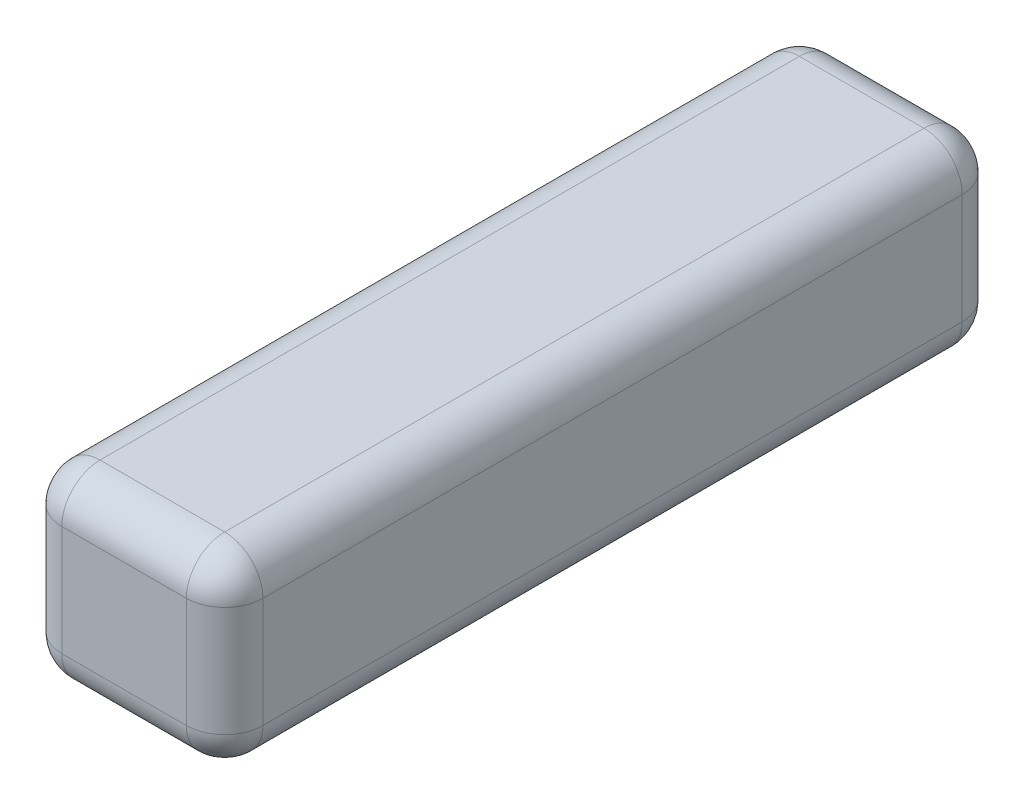
ISO-10303-21;
HEADER;
FILE_DESCRIPTION(('STEP AP214'),'2;1');
FILE_NAME('part.step','',(''),(''),'','','');
FILE_SCHEMA(('AUTOMOTIVE_DESIGN { 1 0 10303 214 1 1 1 1 }'));
ENDSEC;
DATA;
#1=APPLICATION_CONTEXT('core data for automotive mechanical design processes');
#2=APPLICATION_PROTOCOL_DEFINITION('international standard','automotive_design',2000,#1);
#3=PRODUCT_CONTEXT('',#1,'mechanical');
#4=PRODUCT('Part','Part','',(#3));
#5=PRODUCT_RELATED_PRODUCT_CATEGORY('part','',(#4));
#6=PRODUCT_DEFINITION_FORMATION('','',#4);
#7=PRODUCT_DEFINITION_CONTEXT('part definition',#1,'design');
#8=PRODUCT_DEFINITION('design','',#6,#7);
#9=PRODUCT_DEFINITION_SHAPE('','',#8);
#10=(LENGTH_UNIT() NAMED_UNIT(*) SI_UNIT(.MILLI.,.METRE.));
#11=(NAMED_UNIT(*) PLANE_ANGLE_UNIT() SI_UNIT($,.RADIAN.));
#12=(NAMED_UNIT(*) SI_UNIT($,.STERADIAN.) SOLID_ANGLE_UNIT());
#13=UNCERTAINTY_MEASURE_WITH_UNIT(LENGTH_MEASURE(1.E-05),#10,'distance_accuracy_value','');
#14=(GEOMETRIC_REPRESENTATION_CONTEXT(3) GLOBAL_UNCERTAINTY_ASSIGNED_CONTEXT((#13)) GLOBAL_UNIT_ASSIGNED_CONTEXT((#10,
#11,#12)) REPRESENTATION_CONTEXT('',''));
#15=CARTESIAN_POINT('',(0.,0.,0.));
#16=DIRECTION('',(0.,0.,1.));
#17=DIRECTION('',(1.,0.,0.));
#18=AXIS2_PLACEMENT_3D('',#15,#16,#17);
#19=CARTESIAN_POINT('',(-13.335,-12.3825,102.87));
#20=DIRECTION('',(1.,0.,0.));
#21=DIRECTION('',(0.,0.,-1.));
#22=AXIS2_PLACEMENT_3D('',#19,#20,#21);
#23=PLANE('',#22);
#24=DIRECTION('',(0.,0.,-1.));
#25=VECTOR('',#24,1.);
#26=CARTESIAN_POINT('',(-13.335,7.3025,102.87));
#27=LINE('',#26,#25);
#28=CARTESIAN_POINT('',(-13.335,7.3025,97.79));
#29=VERTEX_POINT('',#28);
#30=CARTESIAN_POINT('',(-13.335,7.3025,5.08));
#31=VERTEX_POINT('',#30);
#32=EDGE_CURVE('E313',#29,#31,#27,.T.);
#33=ORIENTED_EDGE('',*,*,#32,.T.);
#34=DIRECTION('',(0.,-1.,0.));
#35=VECTOR('',#34,1.);
#36=CARTESIAN_POINT('',(-13.335,-12.3825,5.08));
#37=LINE('',#36,#35);
#38=CARTESIAN_POINT('',(-13.335,-7.3025,5.08));
#39=VERTEX_POINT('',#38);
#40=EDGE_CURVE('E316',#31,#39,#37,.T.);
#41=ORIENTED_EDGE('',*,*,#40,.T.);
#42=DIRECTION('',(0.,0.,-1.));
#43=VECTOR('',#42,1.);
#44=CARTESIAN_POINT('',(-13.335,-7.3025,102.87));
#45=LINE('',#44,#43);
#46=CARTESIAN_POINT('',(-13.335,-7.3025,97.79));
#47=VERTEX_POINT('',#46);
#48=EDGE_CURVE('E311',#39,#47,#45,.F.);
#49=ORIENTED_EDGE('',*,*,#48,.T.);
#50=DIRECTION('',(0.,-1.,0.));
#51=VECTOR('',#50,1.);
#52=CARTESIAN_POINT('',(-13.335,-12.3825,97.79));
#53=LINE('',#52,#51);
#54=EDGE_CURVE('E309',#47,#29,#53,.F.);
#55=ORIENTED_EDGE('',*,*,#54,.T.);
#56=EDGE_LOOP('',(#33,#41,#49,#55));
#57=FACE_BOUND('',#56,.T.);
#58=ADVANCED_FACE('F37',(#57),#23,.F.);
#59=CARTESIAN_POINT('',(-13.335,-12.3825,102.87));
#60=DIRECTION('',(0.,1.,0.));
#61=DIRECTION('',(0.,0.,1.));
#62=AXIS2_PLACEMENT_3D('',#59,#60,#61);
#63=PLANE('',#62);
#64=DIRECTION('',(1.,0.,0.));
#65=VECTOR('',#64,1.);
#66=CARTESIAN_POINT('',(13.335,-12.3825,5.08));
#67=LINE('',#66,#65);
#68=CARTESIAN_POINT('',(-8.255,-12.3825,5.08));
#69=VERTEX_POINT('',#68);
#70=CARTESIAN_POINT('',(8.255,-12.3825,5.08));
#71=VERTEX_POINT('',#70);
#72=EDGE_CURVE('E304',#69,#71,#67,.T.);
#73=ORIENTED_EDGE('',*,*,#72,.T.);
#74=DIRECTION('',(0.,0.,-1.));
#75=VECTOR('',#74,1.);
#76=CARTESIAN_POINT('',(8.255,-12.3825,102.87));
#77=LINE('',#76,#75);
#78=CARTESIAN_POINT('',(8.255,-12.3825,97.79));
#79=VERTEX_POINT('',#78);
#80=EDGE_CURVE('E306',#71,#79,#77,.F.);
#81=ORIENTED_EDGE('',*,*,#80,.T.);
#82=DIRECTION('',(1.,0.,0.));
#83=VECTOR('',#82,1.);
#84=CARTESIAN_POINT('',(-13.335,-12.3825,97.79));
#85=LINE('',#84,#83);
#86=CARTESIAN_POINT('',(-8.255,-12.3825,97.79));
#87=VERTEX_POINT('',#86);
#88=EDGE_CURVE('E300',#79,#87,#85,.F.);
#89=ORIENTED_EDGE('',*,*,#88,.T.);
#90=DIRECTION('',(0.,0.,-1.));
#91=VECTOR('',#90,1.);
#92=CARTESIAN_POINT('',(-8.255,-12.3825,102.87));
#93=LINE('',#92,#91);
#94=EDGE_CURVE('E302',#87,#69,#93,.T.);
#95=ORIENTED_EDGE('',*,*,#94,.T.);
#96=EDGE_LOOP('',(#73,#81,#89,#95));
#97=FACE_BOUND('',#96,.T.);
#98=ADVANCED_FACE('F434',(#97),#63,.F.);
#99=CARTESIAN_POINT('',(13.335,-12.3825,102.87));
#100=DIRECTION('',(-1.,0.,0.));
#101=DIRECTION('',(0.,0.,1.));
#102=AXIS2_PLACEMENT_3D('',#99,#100,#101);
#103=PLANE('',#102);
#104=DIRECTION('',(0.,1.,0.));
#105=VECTOR('',#104,1.);
#106=CARTESIAN_POINT('',(13.335,12.3825,5.08));
#107=LINE('',#106,#105);
#108=CARTESIAN_POINT('',(13.335,-7.3025,5.08));
#109=VERTEX_POINT('',#108);
#110=CARTESIAN_POINT('',(13.335,7.3025,5.08));
#111=VERTEX_POINT('',#110);
#112=EDGE_CURVE('E286',#109,#111,#107,.T.);
#113=ORIENTED_EDGE('',*,*,#112,.T.);
#114=DIRECTION('',(0.,0.,-1.));
#115=VECTOR('',#114,1.);
#116=CARTESIAN_POINT('',(13.335,7.3025,102.87));
#117=LINE('',#116,#115);
#118=CARTESIAN_POINT('',(13.335,7.3025,97.79));
#119=VERTEX_POINT('',#118);
#120=EDGE_CURVE('E288',#111,#119,#117,.F.);
#121=ORIENTED_EDGE('',*,*,#120,.T.);
#122=DIRECTION('',(0.,1.,0.));
#123=VECTOR('',#122,1.);
#124=CARTESIAN_POINT('',(13.335,-12.3825,97.79));
#125=LINE('',#124,#123);
#126=CARTESIAN_POINT('',(13.335,-7.3025,97.79));
#127=VERTEX_POINT('',#126);
#128=EDGE_CURVE('E282',#119,#127,#125,.F.);
#129=ORIENTED_EDGE('',*,*,#128,.T.);
#130=DIRECTION('',(0.,0.,-1.));
#131=VECTOR('',#130,1.);
#132=CARTESIAN_POINT('',(13.335,-7.3025,102.87));
#133=LINE('',#132,#131);
#134=EDGE_CURVE('E284',#127,#109,#133,.T.);
#135=ORIENTED_EDGE('',*,*,#134,.T.);
#136=EDGE_LOOP('',(#113,#121,#129,#135));
#137=FACE_BOUND('',#136,.T.);
#138=ADVANCED_FACE('F472',(#137),#103,.F.);
#139=CARTESIAN_POINT('',(-13.335,12.3825,102.87));
#140=DIRECTION('',(0.,-1.,0.));
#141=DIRECTION('',(0.,0.,-1.));
#142=AXIS2_PLACEMENT_3D('',#139,#140,#141);
#143=PLANE('',#142);
#144=DIRECTION('',(-1.,0.,0.));
#145=VECTOR('',#144,1.);
#146=CARTESIAN_POINT('',(-13.335,12.3825,97.79));
#147=LINE('',#146,#145);
#148=CARTESIAN_POINT('',(-8.255,12.3825,97.79));
#149=VERTEX_POINT('',#148);
#150=CARTESIAN_POINT('',(8.255,12.3825,97.79));
#151=VERTEX_POINT('',#150);
#152=EDGE_CURVE('E273',#149,#151,#147,.F.);
#153=ORIENTED_EDGE('',*,*,#152,.T.);
#154=DIRECTION('',(0.,0.,-1.));
#155=VECTOR('',#154,1.);
#156=CARTESIAN_POINT('',(8.255,12.3825,102.87));
#157=LINE('',#156,#155);
#158=CARTESIAN_POINT('',(8.255,12.3825,5.08));
#159=VERTEX_POINT('',#158);
#160=EDGE_CURVE('E279',#151,#159,#157,.T.);
#161=ORIENTED_EDGE('',*,*,#160,.T.);
#162=DIRECTION('',(-1.,0.,0.));
#163=VECTOR('',#162,1.);
#164=CARTESIAN_POINT('',(-13.335,12.3825,5.08));
#165=LINE('',#164,#163);
#166=CARTESIAN_POINT('',(-8.255,12.3825,5.08));
#167=VERTEX_POINT('',#166);
#168=EDGE_CURVE('E277',#159,#167,#165,.T.);
#169=ORIENTED_EDGE('',*,*,#168,.T.);
#170=DIRECTION('',(0.,0.,-1.));
#171=VECTOR('',#170,1.);
#172=CARTESIAN_POINT('',(-8.255,12.3825,102.87));
#173=LINE('',#172,#171);
#174=EDGE_CURVE('E275',#167,#149,#173,.F.);
#175=ORIENTED_EDGE('',*,*,#174,.T.);
#176=EDGE_LOOP('',(#153,#161,#169,#175));
#177=FACE_BOUND('',#176,.T.);
#178=ADVANCED_FACE('F513',(#177),#143,.F.);
#179=CARTESIAN_POINT('',(0.,0.,102.87));
#180=DIRECTION('',(0.,0.,-1.));
#181=DIRECTION('',(-1.,0.,0.));
#182=AXIS2_PLACEMENT_3D('',#179,#180,#181);
#183=PLANE('',#182);
#184=DIRECTION('',(0.,1.,0.));
#185=VECTOR('',#184,1.);
#186=CARTESIAN_POINT('',(8.255,0.,102.87));
#187=LINE('',#186,#185);
#188=CARTESIAN_POINT('',(8.255,-7.3025,102.87));
#189=VERTEX_POINT('',#188);
#190=CARTESIAN_POINT('',(8.255,7.3025,102.87));
#191=VERTEX_POINT('',#190);
#192=EDGE_CURVE('E46',#189,#191,#187,.T.);
#193=ORIENTED_EDGE('',*,*,#192,.T.);
#194=DIRECTION('',(-1.,0.,0.));
#195=VECTOR('',#194,1.);
#196=CARTESIAN_POINT('',(0.,7.3025,102.87));
#197=LINE('',#196,#195);
#198=CARTESIAN_POINT('',(-8.255,7.3025,102.87));
#199=VERTEX_POINT('',#198);
#200=EDGE_CURVE('E11',#191,#199,#197,.T.);
#201=ORIENTED_EDGE('',*,*,#200,.T.);
#202=DIRECTION('',(0.,-1.,0.));
#203=VECTOR('',#202,1.);
#204=CARTESIAN_POINT('',(-8.255,0.,102.87));
#205=LINE('',#204,#203);
#206=CARTESIAN_POINT('',(-8.255,-7.3025,102.87));
#207=VERTEX_POINT('',#206);
#208=EDGE_CURVE('E318',#199,#207,#205,.T.);
#209=ORIENTED_EDGE('',*,*,#208,.T.);
#210=DIRECTION('',(1.,0.,0.));
#211=VECTOR('',#210,1.);
#212=CARTESIAN_POINT('',(0.,-7.3025,102.87));
#213=LINE('',#212,#211);
#214=EDGE_CURVE('E320',#207,#189,#213,.T.);
#215=ORIENTED_EDGE('',*,*,#214,.T.);
#216=EDGE_LOOP('',(#193,#201,#209,#215));
#217=FACE_BOUND('',#216,.T.);
#218=ADVANCED_FACE('F404',(#217),#183,.F.);
#219=CARTESIAN_POINT('',(0.,0.,0.));
#220=DIRECTION('',(0.,0.,-1.));
#221=DIRECTION('',(-1.,0.,0.));
#222=AXIS2_PLACEMENT_3D('',#219,#220,#221);
#223=PLANE('',#222);
#224=DIRECTION('',(0.,-1.,0.));
#225=VECTOR('',#224,1.);
#226=CARTESIAN_POINT('',(5.715,-0.317500000000001,0.));
#227=LINE('',#226,#225);
#228=CARTESIAN_POINT('',(5.715,-0.317500000000001,0.));
#229=VERTEX_POINT('',#228);
#230=CARTESIAN_POINT('',(5.715,-4.7625,0.));
#231=VERTEX_POINT('',#230);
#232=EDGE_CURVE('E54',#229,#231,#227,.T.);
#233=ORIENTED_EDGE('',*,*,#232,.F.);
#234=DIRECTION('',(1.,0.,0.));
#235=VECTOR('',#234,1.);
#236=CARTESIAN_POINT('',(5.715,-0.317500000000001,0.));
#237=LINE('',#236,#235);
#238=CARTESIAN_POINT('',(-5.715,-0.3175,0.));
#239=VERTEX_POINT('',#238);
#240=EDGE_CURVE('E208',#239,#229,#237,.T.);
#241=ORIENTED_EDGE('',*,*,#240,.F.);
#242=DIRECTION('',(0.,1.,0.));
#243=VECTOR('',#242,1.);
#244=CARTESIAN_POINT('',(-5.715,-0.3175,0.));
#245=LINE('',#244,#243);
#246=CARTESIAN_POINT('',(-5.715,-4.7625,0.));
#247=VERTEX_POINT('',#246);
#248=EDGE_CURVE('E211',#247,#239,#245,.T.);
#249=ORIENTED_EDGE('',*,*,#248,.F.);
#250=DIRECTION('',(-1.,0.,0.));
#251=VECTOR('',#250,1.);
#252=CARTESIAN_POINT('',(5.715,-4.7625,0.));
#253=LINE('',#252,#251);
#254=EDGE_CURVE('E217',#231,#247,#253,.T.);
#255=ORIENTED_EDGE('',*,*,#254,.F.);
#256=EDGE_LOOP('',(#233,#241,#249,#255));
#257=FACE_BOUND('',#256,.T.);
#258=DIRECTION('',(-0.6,-0.8,0.));
#259=VECTOR('',#258,1.);
#260=CARTESIAN_POINT('',(3.4925,3.4925,0.));
#261=LINE('',#260,#259);
#262=CARTESIAN_POINT('',(3.4925,3.4925,0.));
#263=VERTEX_POINT('',#262);
#264=CARTESIAN_POINT('',(2.54,2.2225,0.));
#265=VERTEX_POINT('',#264);
#266=EDGE_CURVE('E62',#263,#265,#261,.T.);
#267=ORIENTED_EDGE('',*,*,#266,.F.);
#268=DIRECTION('',(0.,-1.,0.));
#269=VECTOR('',#268,1.);
#270=CARTESIAN_POINT('',(3.4925,4.7625,0.));
#271=LINE('',#270,#269);
#272=CARTESIAN_POINT('',(3.4925,4.7625,0.));
#273=VERTEX_POINT('',#272);
#274=EDGE_CURVE('E240',#273,#263,#271,.T.);
#275=ORIENTED_EDGE('',*,*,#274,.F.);
#276=DIRECTION('',(1.,0.,0.));
#277=VECTOR('',#276,1.);
#278=CARTESIAN_POINT('',(3.4925,4.7625,0.));
#279=LINE('',#278,#277);
#280=CARTESIAN_POINT('',(-3.4925,4.7625,0.));
#281=VERTEX_POINT('',#280);
#282=EDGE_CURVE('E243',#281,#273,#279,.T.);
#283=ORIENTED_EDGE('',*,*,#282,.F.);
#284=DIRECTION('',(0.,1.,0.));
#285=VECTOR('',#284,1.);
#286=CARTESIAN_POINT('',(-3.4925,4.7625,0.));
#287=LINE('',#286,#285);
#288=CARTESIAN_POINT('',(-3.4925,3.4925,0.));
#289=VERTEX_POINT('',#288);
#290=EDGE_CURVE('E247',#289,#281,#287,.T.);
#291=ORIENTED_EDGE('',*,*,#290,.F.);
#292=DIRECTION('',(-0.6,0.8,0.));
#293=VECTOR('',#292,1.);
#294=CARTESIAN_POINT('',(-2.54,2.2225,0.));
#295=LINE('',#294,#293);
#296=CARTESIAN_POINT('',(-2.54,2.2225,0.));
#297=VERTEX_POINT('',#296);
#298=EDGE_CURVE('E250',#297,#289,#295,.T.);
#299=ORIENTED_EDGE('',*,*,#298,.F.);
#300=DIRECTION('',(-1.,0.,0.));
#301=VECTOR('',#300,1.);
#302=CARTESIAN_POINT('',(2.54,2.2225,0.));
#303=LINE('',#302,#301);
#304=EDGE_CURVE('E253',#265,#297,#303,.T.);
#305=ORIENTED_EDGE('',*,*,#304,.F.);
#306=EDGE_LOOP('',(#267,#275,#283,#291,#299,#305));
#307=FACE_BOUND('',#306,.T.);
#308=DIRECTION('',(-1.,0.,0.));
#309=VECTOR('',#308,1.);
#310=CARTESIAN_POINT('',(13.335,7.3025,0.));
#311=LINE('',#310,#309);
#312=CARTESIAN_POINT('',(-8.255,7.3025,0.));
#313=VERTEX_POINT('',#312);
#314=CARTESIAN_POINT('',(8.255,7.3025,0.));
#315=VERTEX_POINT('',#314);
#316=EDGE_CURVE('E295',#313,#315,#311,.F.);
#317=ORIENTED_EDGE('',*,*,#316,.T.);
#318=DIRECTION('',(0.,1.,0.));
#319=VECTOR('',#318,1.);
#320=CARTESIAN_POINT('',(8.255,-12.3825,0.));
#321=LINE('',#320,#319);
#322=CARTESIAN_POINT('',(8.255,-7.3025,0.));
#323=VERTEX_POINT('',#322);
#324=EDGE_CURVE('E297',#315,#323,#321,.F.);
#325=ORIENTED_EDGE('',*,*,#324,.T.);
#326=DIRECTION('',(1.,0.,0.));
#327=VECTOR('',#326,1.);
#328=CARTESIAN_POINT('',(-13.335,-7.3025,0.));
#329=LINE('',#328,#327);
#330=CARTESIAN_POINT('',(-8.255,-7.3025,0.));
#331=VERTEX_POINT('',#330);
#332=EDGE_CURVE('E293',#323,#331,#329,.F.);
#333=ORIENTED_EDGE('',*,*,#332,.T.);
#334=DIRECTION('',(0.,-1.,0.));
#335=VECTOR('',#334,1.);
#336=CARTESIAN_POINT('',(-8.255,12.3825,0.));
#337=LINE('',#336,#335);
#338=EDGE_CURVE('E291',#331,#313,#337,.F.);
#339=ORIENTED_EDGE('',*,*,#338,.T.);
#340=EDGE_LOOP('',(#317,#325,#333,#339));
#341=FACE_BOUND('',#340,.T.);
#342=ADVANCED_FACE('F520',(#257,#307,#341),#223,.T.);
#343=CARTESIAN_POINT('',(-8.255,-7.3025,102.87));
#344=DIRECTION('',(0.,0.,-1.));
#345=DIRECTION('',(-1.,0.,0.));
#346=AXIS2_PLACEMENT_3D('',#343,#344,#345);
#347=CYLINDRICAL_SURFACE('',#346,5.08);
#348=CARTESIAN_POINT('',(-8.255,-7.3025,97.79));
#349=DIRECTION('',(0.,0.,1.));
#350=DIRECTION('',(1.,0.,0.));
#351=AXIS2_PLACEMENT_3D('',#348,#349,#350);
#352=CIRCLE('',#351,5.08);
#353=EDGE_CURVE('E41',#47,#87,#352,.T.);
#354=ORIENTED_EDGE('',*,*,#353,.F.);
#355=ORIENTED_EDGE('',*,*,#48,.F.);
#356=CARTESIAN_POINT('',(-8.255,-7.3025,5.08));
#357=DIRECTION('',(0.,0.,-1.));
#358=DIRECTION('',(-1.,0.,0.));
#359=AXIS2_PLACEMENT_3D('',#356,#357,#358);
#360=CIRCLE('',#359,5.08);
#361=EDGE_CURVE('E381',#69,#39,#360,.T.);
#362=ORIENTED_EDGE('',*,*,#361,.F.);
#363=ORIENTED_EDGE('',*,*,#94,.F.);
#364=EDGE_LOOP('',(#354,#355,#362,#363));
#365=FACE_BOUND('',#364,.T.);
#366=ADVANCED_FACE('F39',(#365),#347,.T.);
#367=CARTESIAN_POINT('',(-8.255,-7.3025,97.79));
#368=DIRECTION('',(0.,-1.,0.));
#369=DIRECTION('',(0.,0.,-1.));
#370=AXIS2_PLACEMENT_3D('',#367,#368,#369);
#371=SPHERICAL_SURFACE('',#370,5.08);
#372=CARTESIAN_POINT('',(-8.255,-7.3025,97.79));
#373=DIRECTION('',(0.,-1.,0.));
#374=DIRECTION('',(0.,0.,-1.));
#375=AXIS2_PLACEMENT_3D('',#372,#373,#374);
#376=CIRCLE('',#375,5.08);
#377=EDGE_CURVE('E376',#47,#207,#376,.F.);
#378=ORIENTED_EDGE('',*,*,#377,.F.);
#379=ORIENTED_EDGE('',*,*,#353,.T.);
#380=CARTESIAN_POINT('',(-8.255,-7.3025,97.79));
#381=DIRECTION('',(-1.,0.,0.));
#382=DIRECTION('',(0.,0.,1.));
#383=AXIS2_PLACEMENT_3D('',#380,#381,#382);
#384=CIRCLE('',#383,5.08);
#385=EDGE_CURVE('E379',#207,#87,#384,.F.);
#386=ORIENTED_EDGE('',*,*,#385,.F.);
#387=EDGE_LOOP('',(#378,#379,#386));
#388=FACE_BOUND('',#387,.T.);
#389=ADVANCED_FACE('F392',(#388),#371,.T.);
#390=CARTESIAN_POINT('',(-8.255,-7.3025,5.08));
#391=DIRECTION('',(-1.,0.,0.));
#392=DIRECTION('',(0.,0.,1.));
#393=AXIS2_PLACEMENT_3D('',#390,#391,#392);
#394=SPHERICAL_SURFACE('',#393,5.08);
#395=CARTESIAN_POINT('',(-8.255,-7.3025,5.08));
#396=DIRECTION('',(-1.,0.,0.));
#397=DIRECTION('',(0.,0.,1.));
#398=AXIS2_PLACEMENT_3D('',#395,#396,#397);
#399=CIRCLE('',#398,5.08);
#400=EDGE_CURVE('E370',#69,#331,#399,.F.);
#401=ORIENTED_EDGE('',*,*,#400,.F.);
#402=ORIENTED_EDGE('',*,*,#361,.T.);
#403=CARTESIAN_POINT('',(-8.255,-7.3025,5.08));
#404=DIRECTION('',(0.,-1.,0.));
#405=DIRECTION('',(0.,0.,-1.));
#406=AXIS2_PLACEMENT_3D('',#403,#404,#405);
#407=CIRCLE('',#406,5.08);
#408=EDGE_CURVE('E373',#331,#39,#407,.F.);
#409=ORIENTED_EDGE('',*,*,#408,.F.);
#410=EDGE_LOOP('',(#401,#402,#409));
#411=FACE_BOUND('',#410,.T.);
#412=ADVANCED_FACE('F427',(#411),#394,.T.);
#413=CARTESIAN_POINT('',(0.,-7.3025,97.79));
#414=DIRECTION('',(1.,0.,0.));
#415=DIRECTION('',(0.,0.,-1.));
#416=AXIS2_PLACEMENT_3D('',#413,#414,#415);
#417=CYLINDRICAL_SURFACE('',#416,5.08);
#418=ORIENTED_EDGE('',*,*,#385,.T.);
#419=ORIENTED_EDGE('',*,*,#88,.F.);
#420=CARTESIAN_POINT('',(8.255,-7.3025,97.79));
#421=DIRECTION('',(1.,0.,0.));
#422=DIRECTION('',(0.,0.,-1.));
#423=AXIS2_PLACEMENT_3D('',#420,#421,#422);
#424=CIRCLE('',#423,5.08);
#425=EDGE_CURVE('E365',#189,#79,#424,.T.);
#426=ORIENTED_EDGE('',*,*,#425,.F.);
#427=ORIENTED_EDGE('',*,*,#214,.F.);
#428=EDGE_LOOP('',(#418,#419,#426,#427));
#429=FACE_BOUND('',#428,.T.);
#430=ADVANCED_FACE('F400',(#429),#417,.T.);
#431=CARTESIAN_POINT('',(-8.255,0.,97.79));
#432=DIRECTION('',(0.,-1.,0.));
#433=DIRECTION('',(0.,0.,-1.));
#434=AXIS2_PLACEMENT_3D('',#431,#432,#433);
#435=CYLINDRICAL_SURFACE('',#434,5.08);
#436=ORIENTED_EDGE('',*,*,#377,.T.);
#437=ORIENTED_EDGE('',*,*,#208,.F.);
#438=CARTESIAN_POINT('',(-8.255,7.3025,97.79));
#439=DIRECTION('',(0.,1.,0.));
#440=DIRECTION('',(0.,0.,1.));
#441=AXIS2_PLACEMENT_3D('',#438,#439,#440);
#442=CIRCLE('',#441,5.08);
#443=EDGE_CURVE('E362',#29,#199,#442,.T.);
#444=ORIENTED_EDGE('',*,*,#443,.F.);
#445=ORIENTED_EDGE('',*,*,#54,.F.);
#446=EDGE_LOOP('',(#436,#437,#444,#445));
#447=FACE_BOUND('',#446,.T.);
#448=ADVANCED_FACE('F410',(#447),#435,.T.);
#449=CARTESIAN_POINT('',(-8.255,7.3025,102.87));
#450=DIRECTION('',(0.,0.,-1.));
#451=DIRECTION('',(-1.,0.,0.));
#452=AXIS2_PLACEMENT_3D('',#449,#450,#451);
#453=CYLINDRICAL_SURFACE('',#452,5.08);
#454=CARTESIAN_POINT('',(-8.255,7.3025,5.08));
#455=DIRECTION('',(0.,0.,-1.));
#456=DIRECTION('',(-1.,0.,0.));
#457=AXIS2_PLACEMENT_3D('',#454,#455,#456);
#458=CIRCLE('',#457,5.08);
#459=EDGE_CURVE('E356',#31,#167,#458,.T.);
#460=ORIENTED_EDGE('',*,*,#459,.F.);
#461=ORIENTED_EDGE('',*,*,#32,.F.);
#462=CARTESIAN_POINT('',(-8.255,7.3025,97.79));
#463=DIRECTION('',(0.,0.,1.));
#464=DIRECTION('',(1.,0.,0.));
#465=AXIS2_PLACEMENT_3D('',#462,#463,#464);
#466=CIRCLE('',#465,5.08);
#467=EDGE_CURVE('E359',#149,#29,#466,.T.);
#468=ORIENTED_EDGE('',*,*,#467,.F.);
#469=ORIENTED_EDGE('',*,*,#174,.F.);
#470=EDGE_LOOP('',(#460,#461,#468,#469));
#471=FACE_BOUND('',#470,.T.);
#472=ADVANCED_FACE('F416',(#471),#453,.T.);
#473=CARTESIAN_POINT('',(-8.255,-12.3825,5.08));
#474=DIRECTION('',(0.,1.,0.));
#475=DIRECTION('',(0.,0.,1.));
#476=AXIS2_PLACEMENT_3D('',#473,#474,#475);
#477=CYLINDRICAL_SURFACE('',#476,5.08);
#478=ORIENTED_EDGE('',*,*,#408,.T.);
#479=ORIENTED_EDGE('',*,*,#40,.F.);
#480=CARTESIAN_POINT('',(-8.255,7.3025,5.08));
#481=DIRECTION('',(0.,1.,0.));
#482=DIRECTION('',(-1.,0.,0.));
#483=AXIS2_PLACEMENT_3D('',#480,#481,#482);
#484=CIRCLE('',#483,5.08);
#485=EDGE_CURVE('E354',#313,#31,#484,.T.);
#486=ORIENTED_EDGE('',*,*,#485,.F.);
#487=ORIENTED_EDGE('',*,*,#338,.F.);
#488=EDGE_LOOP('',(#478,#479,#486,#487));
#489=FACE_BOUND('',#488,.T.);
#490=ADVANCED_FACE('F424',(#489),#477,.T.);
#491=CARTESIAN_POINT('',(-13.335,-7.3025,5.08));
#492=DIRECTION('',(-1.,0.,0.));
#493=DIRECTION('',(0.,0.,1.));
#494=AXIS2_PLACEMENT_3D('',#491,#492,#493);
#495=CYLINDRICAL_SURFACE('',#494,5.08);
#496=ORIENTED_EDGE('',*,*,#400,.T.);
#497=ORIENTED_EDGE('',*,*,#332,.F.);
#498=CARTESIAN_POINT('',(8.255,-7.3025,5.08));
#499=DIRECTION('',(1.,0.,0.));
#500=DIRECTION('',(0.,0.,-1.));
#501=AXIS2_PLACEMENT_3D('',#498,#499,#500);
#502=CIRCLE('',#501,5.08);
#503=EDGE_CURVE('E351',#71,#323,#502,.T.);
#504=ORIENTED_EDGE('',*,*,#503,.F.);
#505=ORIENTED_EDGE('',*,*,#72,.F.);
#506=EDGE_LOOP('',(#496,#497,#504,#505));
#507=FACE_BOUND('',#506,.T.);
#508=ADVANCED_FACE('F431',(#507),#495,.T.);
#509=CARTESIAN_POINT('',(8.255,-7.3025,102.87));
#510=DIRECTION('',(0.,0.,-1.));
#511=DIRECTION('',(-1.,0.,0.));
#512=AXIS2_PLACEMENT_3D('',#509,#510,#511);
#513=CYLINDRICAL_SURFACE('',#512,5.08);
#514=CARTESIAN_POINT('',(8.255,-7.3025,97.79));
#515=DIRECTION('',(0.,0.,1.));
#516=DIRECTION('',(1.,0.,0.));
#517=AXIS2_PLACEMENT_3D('',#514,#515,#516);
#518=CIRCLE('',#517,5.08);
#519=EDGE_CURVE('E367',#79,#127,#518,.T.);
#520=ORIENTED_EDGE('',*,*,#519,.F.);
#521=ORIENTED_EDGE('',*,*,#80,.F.);
#522=CARTESIAN_POINT('',(8.255,-7.3025,5.08));
#523=DIRECTION('',(0.,0.,-1.));
#524=DIRECTION('',(-1.,0.,0.));
#525=AXIS2_PLACEMENT_3D('',#522,#523,#524);
#526=CIRCLE('',#525,5.08);
#527=EDGE_CURVE('E348',#109,#71,#526,.T.);
#528=ORIENTED_EDGE('',*,*,#527,.F.);
#529=ORIENTED_EDGE('',*,*,#134,.F.);
#530=EDGE_LOOP('',(#520,#521,#528,#529));
#531=FACE_BOUND('',#530,.T.);
#532=ADVANCED_FACE('F438',(#531),#513,.T.);
#533=CARTESIAN_POINT('',(8.255,-7.3025,97.79));
#534=DIRECTION('',(0.,-1.,0.));
#535=DIRECTION('',(0.,0.,-1.));
#536=AXIS2_PLACEMENT_3D('',#533,#534,#535);
#537=SPHERICAL_SURFACE('',#536,5.08);
#538=ORIENTED_EDGE('',*,*,#425,.T.);
#539=ORIENTED_EDGE('',*,*,#519,.T.);
#540=CARTESIAN_POINT('',(8.255,-7.3025,97.79));
#541=DIRECTION('',(0.,-1.,0.));
#542=DIRECTION('',(0.,0.,-1.));
#543=AXIS2_PLACEMENT_3D('',#540,#541,#542);
#544=CIRCLE('',#543,5.08);
#545=EDGE_CURVE('E345',#189,#127,#544,.F.);
#546=ORIENTED_EDGE('',*,*,#545,.F.);
#547=EDGE_LOOP('',(#538,#539,#546));
#548=FACE_BOUND('',#547,.T.);
#549=ADVANCED_FACE('F442',(#548),#537,.T.);
#550=CARTESIAN_POINT('',(-8.255,7.3025,97.79));
#551=DIRECTION('',(-1.,0.,0.));
#552=DIRECTION('',(0.,-1.,0.));
#553=AXIS2_PLACEMENT_3D('',#550,#551,#552);
#554=SPHERICAL_SURFACE('',#553,5.08);
#555=ORIENTED_EDGE('',*,*,#467,.T.);
#556=ORIENTED_EDGE('',*,*,#443,.T.);
#557=CARTESIAN_POINT('',(-8.255,7.3025,97.79));
#558=DIRECTION('',(-1.,0.,0.));
#559=DIRECTION('',(0.,0.,1.));
#560=AXIS2_PLACEMENT_3D('',#557,#558,#559);
#561=CIRCLE('',#560,5.08);
#562=EDGE_CURVE('E343',#149,#199,#561,.F.);
#563=ORIENTED_EDGE('',*,*,#562,.F.);
#564=EDGE_LOOP('',(#555,#556,#563));
#565=FACE_BOUND('',#564,.T.);
#566=ADVANCED_FACE('F456',(#565),#554,.T.);
#567=CARTESIAN_POINT('',(-8.255,7.3025,5.08));
#568=DIRECTION('',(-1.,0.,0.));
#569=DIRECTION('',(0.,0.,1.));
#570=AXIS2_PLACEMENT_3D('',#567,#568,#569);
#571=SPHERICAL_SURFACE('',#570,5.08);
#572=ORIENTED_EDGE('',*,*,#485,.T.);
#573=ORIENTED_EDGE('',*,*,#459,.T.);
#574=CARTESIAN_POINT('',(-8.255,7.3025,5.08));
#575=DIRECTION('',(-1.,0.,0.));
#576=DIRECTION('',(0.,0.,1.));
#577=AXIS2_PLACEMENT_3D('',#574,#575,#576);
#578=CIRCLE('',#577,5.08);
#579=EDGE_CURVE('E340',#313,#167,#578,.F.);
#580=ORIENTED_EDGE('',*,*,#579,.F.);
#581=EDGE_LOOP('',(#572,#573,#580));
#582=FACE_BOUND('',#581,.T.);
#583=ADVANCED_FACE('F458',(#582),#571,.T.);
#584=CARTESIAN_POINT('',(8.255,-7.3025,5.08));
#585=DIRECTION('',(0.,-1.,0.));
#586=DIRECTION('',(0.,0.,-1.));
#587=AXIS2_PLACEMENT_3D('',#584,#585,#586);
#588=SPHERICAL_SURFACE('',#587,5.08);
#589=ORIENTED_EDGE('',*,*,#527,.T.);
#590=ORIENTED_EDGE('',*,*,#503,.T.);
#591=CARTESIAN_POINT('',(8.255,-7.3025,5.08));
#592=DIRECTION('',(0.,-1.,0.));
#593=DIRECTION('',(0.,0.,-1.));
#594=AXIS2_PLACEMENT_3D('',#591,#592,#593);
#595=CIRCLE('',#594,5.08);
#596=EDGE_CURVE('E338',#109,#323,#595,.F.);
#597=ORIENTED_EDGE('',*,*,#596,.F.);
#598=EDGE_LOOP('',(#589,#590,#597));
#599=FACE_BOUND('',#598,.T.);
#600=ADVANCED_FACE('F464',(#599),#588,.T.);
#601=CARTESIAN_POINT('',(8.255,0.,97.79));
#602=DIRECTION('',(0.,1.,0.));
#603=DIRECTION('',(0.,0.,1.));
#604=AXIS2_PLACEMENT_3D('',#601,#602,#603);
#605=CYLINDRICAL_SURFACE('',#604,5.08);
#606=ORIENTED_EDGE('',*,*,#545,.T.);
#607=ORIENTED_EDGE('',*,*,#128,.F.);
#608=CARTESIAN_POINT('',(8.255,7.3025,97.79));
#609=DIRECTION('',(0.,1.,0.));
#610=DIRECTION('',(0.,0.,1.));
#611=AXIS2_PLACEMENT_3D('',#608,#609,#610);
#612=CIRCLE('',#611,5.08);
#613=EDGE_CURVE('E335',#191,#119,#612,.T.);
#614=ORIENTED_EDGE('',*,*,#613,.F.);
#615=ORIENTED_EDGE('',*,*,#192,.F.);
#616=EDGE_LOOP('',(#606,#607,#614,#615));
#617=FACE_BOUND('',#616,.T.);
#618=ADVANCED_FACE('F445',(#617),#605,.T.);
#619=CARTESIAN_POINT('',(0.,7.3025,97.79));
#620=DIRECTION('',(-1.,0.,0.));
#621=DIRECTION('',(0.,0.,1.));
#622=AXIS2_PLACEMENT_3D('',#619,#620,#621);
#623=CYLINDRICAL_SURFACE('',#622,5.08);
#624=ORIENTED_EDGE('',*,*,#562,.T.);
#625=ORIENTED_EDGE('',*,*,#200,.F.);
#626=CARTESIAN_POINT('',(8.255,7.3025,97.79));
#627=DIRECTION('',(1.,0.,0.));
#628=DIRECTION('',(0.,0.,-1.));
#629=AXIS2_PLACEMENT_3D('',#626,#627,#628);
#630=CIRCLE('',#629,5.08);
#631=EDGE_CURVE('E332',#151,#191,#630,.T.);
#632=ORIENTED_EDGE('',*,*,#631,.F.);
#633=ORIENTED_EDGE('',*,*,#152,.F.);
#634=EDGE_LOOP('',(#624,#625,#632,#633));
#635=FACE_BOUND('',#634,.T.);
#636=ADVANCED_FACE('F454',(#635),#623,.T.);
#637=CARTESIAN_POINT('',(-13.335,7.3025,5.08));
#638=DIRECTION('',(1.,0.,0.));
#639=DIRECTION('',(0.,0.,-1.));
#640=AXIS2_PLACEMENT_3D('',#637,#638,#639);
#641=CYLINDRICAL_SURFACE('',#640,5.08);
#642=ORIENTED_EDGE('',*,*,#579,.T.);
#643=ORIENTED_EDGE('',*,*,#168,.F.);
#644=CARTESIAN_POINT('',(8.255,7.3025,5.08));
#645=DIRECTION('',(1.,0.,0.));
#646=DIRECTION('',(0.,0.,-1.));
#647=AXIS2_PLACEMENT_3D('',#644,#645,#646);
#648=CIRCLE('',#647,5.08);
#649=EDGE_CURVE('E329',#315,#159,#648,.T.);
#650=ORIENTED_EDGE('',*,*,#649,.F.);
#651=ORIENTED_EDGE('',*,*,#316,.F.);
#652=EDGE_LOOP('',(#642,#643,#650,#651));
#653=FACE_BOUND('',#652,.T.);
#654=ADVANCED_FACE('F490',(#653),#641,.T.);
#655=CARTESIAN_POINT('',(8.255,-12.3825,5.08));
#656=DIRECTION('',(0.,-1.,0.));
#657=DIRECTION('',(0.,0.,-1.));
#658=AXIS2_PLACEMENT_3D('',#655,#656,#657);
#659=CYLINDRICAL_SURFACE('',#658,5.08);
#660=ORIENTED_EDGE('',*,*,#596,.T.);
#661=ORIENTED_EDGE('',*,*,#324,.F.);
#662=CARTESIAN_POINT('',(8.255,7.3025,5.08));
#663=DIRECTION('',(0.,1.,0.));
#664=DIRECTION('',(0.,0.,1.));
#665=AXIS2_PLACEMENT_3D('',#662,#663,#664);
#666=CIRCLE('',#665,5.08);
#667=EDGE_CURVE('E326',#111,#315,#666,.T.);
#668=ORIENTED_EDGE('',*,*,#667,.F.);
#669=ORIENTED_EDGE('',*,*,#112,.F.);
#670=EDGE_LOOP('',(#660,#661,#668,#669));
#671=FACE_BOUND('',#670,.T.);
#672=ADVANCED_FACE('F487',(#671),#659,.T.);
#673=CARTESIAN_POINT('',(8.255,7.3025,97.79));
#674=DIRECTION('',(0.,0.,1.));
#675=DIRECTION('',(1.,0.,0.));
#676=AXIS2_PLACEMENT_3D('',#673,#674,#675);
#677=SPHERICAL_SURFACE('',#676,5.08);
#678=ORIENTED_EDGE('',*,*,#631,.T.);
#679=ORIENTED_EDGE('',*,*,#613,.T.);
#680=CARTESIAN_POINT('',(8.255,7.3025,97.79));
#681=DIRECTION('',(0.,0.,1.));
#682=DIRECTION('',(1.,0.,0.));
#683=AXIS2_PLACEMENT_3D('',#680,#681,#682);
#684=CIRCLE('',#683,5.08);
#685=EDGE_CURVE('E324',#151,#119,#684,.F.);
#686=ORIENTED_EDGE('',*,*,#685,.F.);
#687=EDGE_LOOP('',(#678,#679,#686));
#688=FACE_BOUND('',#687,.T.);
#689=ADVANCED_FACE('F450',(#688),#677,.T.);
#690=CARTESIAN_POINT('',(8.255,7.3025,5.08));
#691=DIRECTION('',(0.,0.,-1.));
#692=DIRECTION('',(-1.,0.,0.));
#693=AXIS2_PLACEMENT_3D('',#690,#691,#692);
#694=SPHERICAL_SURFACE('',#693,5.08);
#695=ORIENTED_EDGE('',*,*,#667,.T.);
#696=ORIENTED_EDGE('',*,*,#649,.T.);
#697=CARTESIAN_POINT('',(8.255,7.3025,5.08));
#698=DIRECTION('',(0.,0.,-1.));
#699=DIRECTION('',(-1.,0.,0.));
#700=AXIS2_PLACEMENT_3D('',#697,#698,#699);
#701=CIRCLE('',#700,5.08);
#702=EDGE_CURVE('E223',#111,#159,#701,.F.);
#703=ORIENTED_EDGE('',*,*,#702,.F.);
#704=EDGE_LOOP('',(#695,#696,#703));
#705=FACE_BOUND('',#704,.T.);
#706=ADVANCED_FACE('F480',(#705),#694,.T.);
#707=CARTESIAN_POINT('',(8.255,7.3025,102.87));
#708=DIRECTION('',(0.,0.,-1.));
#709=DIRECTION('',(-1.,0.,0.));
#710=AXIS2_PLACEMENT_3D('',#707,#708,#709);
#711=CYLINDRICAL_SURFACE('',#710,5.08);
#712=ORIENTED_EDGE('',*,*,#685,.T.);
#713=ORIENTED_EDGE('',*,*,#120,.F.);
#714=ORIENTED_EDGE('',*,*,#702,.T.);
#715=ORIENTED_EDGE('',*,*,#160,.F.);
#716=EDGE_LOOP('',(#712,#713,#714,#715));
#717=FACE_BOUND('',#716,.T.);
#718=ADVANCED_FACE('F476',(#717),#711,.T.);
#719=CARTESIAN_POINT('',(3.4925,3.4925,12.7));
#720=DIRECTION('',(0.8,-0.6,0.));
#721=DIRECTION('',(0.6,0.8,0.));
#722=AXIS2_PLACEMENT_3D('',#719,#720,#721);
#723=PLANE('',#722);
#724=ORIENTED_EDGE('',*,*,#266,.T.);
#725=DIRECTION('',(0.,0.,-1.));
#726=VECTOR('',#725,1.);
#727=CARTESIAN_POINT('',(2.54,2.2225,12.7));
#728=LINE('',#727,#726);
#729=CARTESIAN_POINT('',(2.54,2.2225,12.7));
#730=VERTEX_POINT('',#729);
#731=EDGE_CURVE('E227',#730,#265,#728,.T.);
#732=ORIENTED_EDGE('',*,*,#731,.F.);
#733=DIRECTION('',(-0.6,-0.8,0.));
#734=VECTOR('',#733,1.);
#735=CARTESIAN_POINT('',(3.4925,3.4925,12.7));
#736=LINE('',#735,#734);
#737=CARTESIAN_POINT('',(3.4925,3.4925,12.7));
#738=VERTEX_POINT('',#737);
#739=EDGE_CURVE('E244',#738,#730,#736,.T.);
#740=ORIENTED_EDGE('',*,*,#739,.F.);
#741=DIRECTION('',(0.,0.,-1.));
#742=VECTOR('',#741,1.);
#743=CARTESIAN_POINT('',(3.4925,3.4925,12.7));
#744=LINE('',#743,#742);
#745=EDGE_CURVE('E238',#738,#263,#744,.T.);
#746=ORIENTED_EDGE('',*,*,#745,.T.);
#747=EDGE_LOOP('',(#724,#732,#740,#746));
#748=FACE_BOUND('',#747,.T.);
#749=ADVANCED_FACE('F479',(#748),#723,.F.);
#750=CARTESIAN_POINT('',(3.4925,4.7625,12.7));
#751=DIRECTION('',(1.,0.,0.));
#752=DIRECTION('',(0.,0.,-1.));
#753=AXIS2_PLACEMENT_3D('',#750,#751,#752);
#754=PLANE('',#753);
#755=ORIENTED_EDGE('',*,*,#274,.T.);
#756=ORIENTED_EDGE('',*,*,#745,.F.);
#757=DIRECTION('',(0.,-1.,0.));
#758=VECTOR('',#757,1.);
#759=CARTESIAN_POINT('',(3.4925,4.7625,12.7));
#760=LINE('',#759,#758);
#761=CARTESIAN_POINT('',(3.4925,4.7625,12.7));
#762=VERTEX_POINT('',#761);
#763=EDGE_CURVE('E229',#762,#738,#760,.T.);
#764=ORIENTED_EDGE('',*,*,#763,.F.);
#765=DIRECTION('',(0.,0.,-1.));
#766=VECTOR('',#765,1.);
#767=CARTESIAN_POINT('',(3.4925,4.7625,12.7));
#768=LINE('',#767,#766);
#769=EDGE_CURVE('E236',#762,#273,#768,.T.);
#770=ORIENTED_EDGE('',*,*,#769,.T.);
#771=EDGE_LOOP('',(#755,#756,#764,#770));
#772=FACE_BOUND('',#771,.T.);
#773=ADVANCED_FACE('F531',(#772),#754,.F.);
#774=CARTESIAN_POINT('',(3.4925,4.7625,12.7));
#775=DIRECTION('',(0.,1.,0.));
#776=DIRECTION('',(-1.,0.,0.));
#777=AXIS2_PLACEMENT_3D('',#774,#775,#776);
#778=PLANE('',#777);
#779=ORIENTED_EDGE('',*,*,#282,.T.);
#780=ORIENTED_EDGE('',*,*,#769,.F.);
#781=DIRECTION('',(1.,0.,0.));
#782=VECTOR('',#781,1.);
#783=CARTESIAN_POINT('',(3.4925,4.7625,12.7));
#784=LINE('',#783,#782);
#785=CARTESIAN_POINT('',(-3.4925,4.7625,12.7));
#786=VERTEX_POINT('',#785);
#787=EDGE_CURVE('E259',#786,#762,#784,.T.);
#788=ORIENTED_EDGE('',*,*,#787,.F.);
#789=DIRECTION('',(0.,0.,-1.));
#790=VECTOR('',#789,1.);
#791=CARTESIAN_POINT('',(-3.4925,4.7625,12.7));
#792=LINE('',#791,#790);
#793=EDGE_CURVE('E234',#786,#281,#792,.T.);
#794=ORIENTED_EDGE('',*,*,#793,.T.);
#795=EDGE_LOOP('',(#779,#780,#788,#794));
#796=FACE_BOUND('',#795,.T.);
#797=ADVANCED_FACE('F534',(#796),#778,.F.);
#798=CARTESIAN_POINT('',(-3.4925,4.7625,12.7));
#799=DIRECTION('',(-1.,0.,0.));
#800=DIRECTION('',(0.,0.,1.));
#801=AXIS2_PLACEMENT_3D('',#798,#799,#800);
#802=PLANE('',#801);
#803=ORIENTED_EDGE('',*,*,#290,.T.);
#804=ORIENTED_EDGE('',*,*,#793,.F.);
#805=DIRECTION('',(0.,1.,0.));
#806=VECTOR('',#805,1.);
#807=CARTESIAN_POINT('',(-3.4925,4.7625,12.7));
#808=LINE('',#807,#806);
#809=CARTESIAN_POINT('',(-3.4925,3.4925,12.7));
#810=VERTEX_POINT('',#809);
#811=EDGE_CURVE('E262',#810,#786,#808,.T.);
#812=ORIENTED_EDGE('',*,*,#811,.F.);
#813=DIRECTION('',(0.,0.,-1.));
#814=VECTOR('',#813,1.);
#815=CARTESIAN_POINT('',(-3.4925,3.4925,12.7));
#816=LINE('',#815,#814);
#817=EDGE_CURVE('E232',#810,#289,#816,.T.);
#818=ORIENTED_EDGE('',*,*,#817,.T.);
#819=EDGE_LOOP('',(#803,#804,#812,#818));
#820=FACE_BOUND('',#819,.T.);
#821=ADVANCED_FACE('F538',(#820),#802,.F.);
#822=CARTESIAN_POINT('',(-2.54,2.2225,12.7));
#823=DIRECTION('',(-0.8,-0.6,0.));
#824=DIRECTION('',(0.6,-0.8,0.));
#825=AXIS2_PLACEMENT_3D('',#822,#823,#824);
#826=PLANE('',#825);
#827=ORIENTED_EDGE('',*,*,#298,.T.);
#828=ORIENTED_EDGE('',*,*,#817,.F.);
#829=DIRECTION('',(-0.6,0.8,0.));
#830=VECTOR('',#829,1.);
#831=CARTESIAN_POINT('',(-2.54,2.2225,12.7));
#832=LINE('',#831,#830);
#833=CARTESIAN_POINT('',(-2.54,2.2225,12.7));
#834=VERTEX_POINT('',#833);
#835=EDGE_CURVE('E265',#834,#810,#832,.T.);
#836=ORIENTED_EDGE('',*,*,#835,.F.);
#837=DIRECTION('',(0.,0.,-1.));
#838=VECTOR('',#837,1.);
#839=CARTESIAN_POINT('',(-2.54,2.2225,12.7));
#840=LINE('',#839,#838);
#841=EDGE_CURVE('E230',#834,#297,#840,.T.);
#842=ORIENTED_EDGE('',*,*,#841,.T.);
#843=EDGE_LOOP('',(#827,#828,#836,#842));
#844=FACE_BOUND('',#843,.T.);
#845=ADVANCED_FACE('F542',(#844),#826,.F.);
#846=CARTESIAN_POINT('',(2.54,2.2225,12.7));
#847=DIRECTION('',(0.,-1.,0.));
#848=DIRECTION('',(1.,0.,0.));
#849=AXIS2_PLACEMENT_3D('',#846,#847,#848);
#850=PLANE('',#849);
#851=ORIENTED_EDGE('',*,*,#304,.T.);
#852=ORIENTED_EDGE('',*,*,#841,.F.);
#853=DIRECTION('',(-1.,0.,0.));
#854=VECTOR('',#853,1.);
#855=CARTESIAN_POINT('',(2.54,2.2225,12.7));
#856=LINE('',#855,#854);
#857=EDGE_CURVE('E268',#730,#834,#856,.T.);
#858=ORIENTED_EDGE('',*,*,#857,.F.);
#859=ORIENTED_EDGE('',*,*,#731,.T.);
#860=EDGE_LOOP('',(#851,#852,#858,#859));
#861=FACE_BOUND('',#860,.T.);
#862=ADVANCED_FACE('F529',(#861),#850,.F.);
#863=CARTESIAN_POINT('',(0.,0.,12.7));
#864=DIRECTION('',(0.,0.,-1.));
#865=DIRECTION('',(-1.,0.,0.));
#866=AXIS2_PLACEMENT_3D('',#863,#864,#865);
#867=PLANE('',#866);
#868=ORIENTED_EDGE('',*,*,#739,.T.);
#869=ORIENTED_EDGE('',*,*,#857,.T.);
#870=ORIENTED_EDGE('',*,*,#835,.T.);
#871=ORIENTED_EDGE('',*,*,#811,.T.);
#872=ORIENTED_EDGE('',*,*,#787,.T.);
#873=ORIENTED_EDGE('',*,*,#763,.T.);
#874=EDGE_LOOP('',(#868,#869,#870,#871,#872,#873));
#875=FACE_BOUND('',#874,.T.);
#876=ADVANCED_FACE('F526',(#875),#867,.T.);
#877=CARTESIAN_POINT('',(5.715,-0.317500000000001,12.7));
#878=DIRECTION('',(1.,0.,0.));
#879=DIRECTION('',(0.,1.,0.));
#880=AXIS2_PLACEMENT_3D('',#877,#878,#879);
#881=PLANE('',#880);
#882=ORIENTED_EDGE('',*,*,#232,.T.);
#883=DIRECTION('',(0.,0.,-1.));
#884=VECTOR('',#883,1.);
#885=CARTESIAN_POINT('',(5.715,-4.7625,12.7));
#886=LINE('',#885,#884);
#887=CARTESIAN_POINT('',(5.715,-4.7625,12.7));
#888=VERTEX_POINT('',#887);
#889=EDGE_CURVE('E186',#888,#231,#886,.T.);
#890=ORIENTED_EDGE('',*,*,#889,.F.);
#891=DIRECTION('',(0.,-1.,0.));
#892=VECTOR('',#891,1.);
#893=CARTESIAN_POINT('',(5.715,-0.317500000000001,12.7));
#894=LINE('',#893,#892);
#895=CARTESIAN_POINT('',(5.715,-0.317500000000001,12.7));
#896=VERTEX_POINT('',#895);
#897=EDGE_CURVE('E190',#896,#888,#894,.T.);
#898=ORIENTED_EDGE('',*,*,#897,.F.);
#899=DIRECTION('',(0.,0.,-1.));
#900=VECTOR('',#899,1.);
#901=CARTESIAN_POINT('',(5.715,-0.317500000000001,12.7));
#902=LINE('',#901,#900);
#903=EDGE_CURVE('E221',#896,#229,#902,.T.);
#904=ORIENTED_EDGE('',*,*,#903,.T.);
#905=EDGE_LOOP('',(#882,#890,#898,#904));
#906=FACE_BOUND('',#905,.T.);
#907=ADVANCED_FACE('F188',(#906),#881,.F.);
#908=CARTESIAN_POINT('',(5.715,-0.317500000000001,12.7));
#909=DIRECTION('',(0.,1.,0.));
#910=DIRECTION('',(-1.,0.,0.));
#911=AXIS2_PLACEMENT_3D('',#908,#909,#910);
#912=PLANE('',#911);
#913=ORIENTED_EDGE('',*,*,#240,.T.);
#914=ORIENTED_EDGE('',*,*,#903,.F.);
#915=DIRECTION('',(1.,0.,0.));
#916=VECTOR('',#915,1.);
#917=CARTESIAN_POINT('',(5.715,-0.317500000000001,12.7));
#918=LINE('',#917,#916);
#919=CARTESIAN_POINT('',(-5.715,-0.3175,12.7));
#920=VERTEX_POINT('',#919);
#921=EDGE_CURVE('E196',#920,#896,#918,.T.);
#922=ORIENTED_EDGE('',*,*,#921,.F.);
#923=DIRECTION('',(0.,0.,-1.));
#924=VECTOR('',#923,1.);
#925=CARTESIAN_POINT('',(-5.715,-0.3175,12.7));
#926=LINE('',#925,#924);
#927=EDGE_CURVE('E224',#920,#239,#926,.T.);
#928=ORIENTED_EDGE('',*,*,#927,.T.);
#929=EDGE_LOOP('',(#913,#914,#922,#928));
#930=FACE_BOUND('',#929,.T.);
#931=ADVANCED_FACE('F554',(#930),#912,.F.);
#932=CARTESIAN_POINT('',(-5.715,-0.3175,12.7));
#933=DIRECTION('',(-1.,0.,0.));
#934=DIRECTION('',(0.,-1.,0.));
#935=AXIS2_PLACEMENT_3D('',#932,#933,#934);
#936=PLANE('',#935);
#937=ORIENTED_EDGE('',*,*,#248,.T.);
#938=ORIENTED_EDGE('',*,*,#927,.F.);
#939=DIRECTION('',(0.,1.,0.));
#940=VECTOR('',#939,1.);
#941=CARTESIAN_POINT('',(-5.715,-0.3175,12.7));
#942=LINE('',#941,#940);
#943=CARTESIAN_POINT('',(-5.715,-4.7625,12.7));
#944=VERTEX_POINT('',#943);
#945=EDGE_CURVE('E204',#944,#920,#942,.T.);
#946=ORIENTED_EDGE('',*,*,#945,.F.);
#947=DIRECTION('',(0.,0.,-1.));
#948=VECTOR('',#947,1.);
#949=CARTESIAN_POINT('',(-5.715,-4.7625,12.7));
#950=LINE('',#949,#948);
#951=EDGE_CURVE('E195',#944,#247,#950,.T.);
#952=ORIENTED_EDGE('',*,*,#951,.T.);
#953=EDGE_LOOP('',(#937,#938,#946,#952));
#954=FACE_BOUND('',#953,.T.);
#955=ADVANCED_FACE('F557',(#954),#936,.F.);
#956=CARTESIAN_POINT('',(5.715,-4.7625,12.7));
#957=DIRECTION('',(0.,-1.,0.));
#958=DIRECTION('',(1.,0.,0.));
#959=AXIS2_PLACEMENT_3D('',#956,#957,#958);
#960=PLANE('',#959);
#961=ORIENTED_EDGE('',*,*,#254,.T.);
#962=ORIENTED_EDGE('',*,*,#951,.F.);
#963=DIRECTION('',(-1.,0.,0.));
#964=VECTOR('',#963,1.);
#965=CARTESIAN_POINT('',(5.715,-4.7625,12.7));
#966=LINE('',#965,#964);
#967=EDGE_CURVE('E199',#888,#944,#966,.T.);
#968=ORIENTED_EDGE('',*,*,#967,.F.);
#969=ORIENTED_EDGE('',*,*,#889,.T.);
#970=EDGE_LOOP('',(#961,#962,#968,#969));
#971=FACE_BOUND('',#970,.T.);
#972=ADVANCED_FACE('F200',(#971),#960,.F.);
#973=CARTESIAN_POINT('',(0.,0.,12.7));
#974=DIRECTION('',(0.,0.,-1.));
#975=DIRECTION('',(-1.,0.,0.));
#976=AXIS2_PLACEMENT_3D('',#973,#974,#975);
#977=PLANE('',#976);
#978=ORIENTED_EDGE('',*,*,#897,.T.);
#979=ORIENTED_EDGE('',*,*,#967,.T.);
#980=ORIENTED_EDGE('',*,*,#945,.T.);
#981=ORIENTED_EDGE('',*,*,#921,.T.);
#982=EDGE_LOOP('',(#978,#979,#980,#981));
#983=FACE_BOUND('',#982,.T.);
#984=ADVANCED_FACE('F206',(#983),#977,.T.);
#985=CLOSED_SHELL('',(#58,#98,#138,#178,#218,#342,#366,#389,#412,#430,#448,#472,#490,#508,#532,
#549,#566,#583,#600,#618,#636,#654,#672,#689,#706,#718,#749,#773,#797,#821,#845,#862,#876,#907,
#931,#955,#972,#984));
#986=MANIFOLD_SOLID_BREP('B2',#985);
#987=ADVANCED_BREP_SHAPE_REPRESENTATION('',(#18,#986),#14);
#988=SHAPE_DEFINITION_REPRESENTATION(#9,#987);
ENDSEC;
END-ISO-10303-21;
